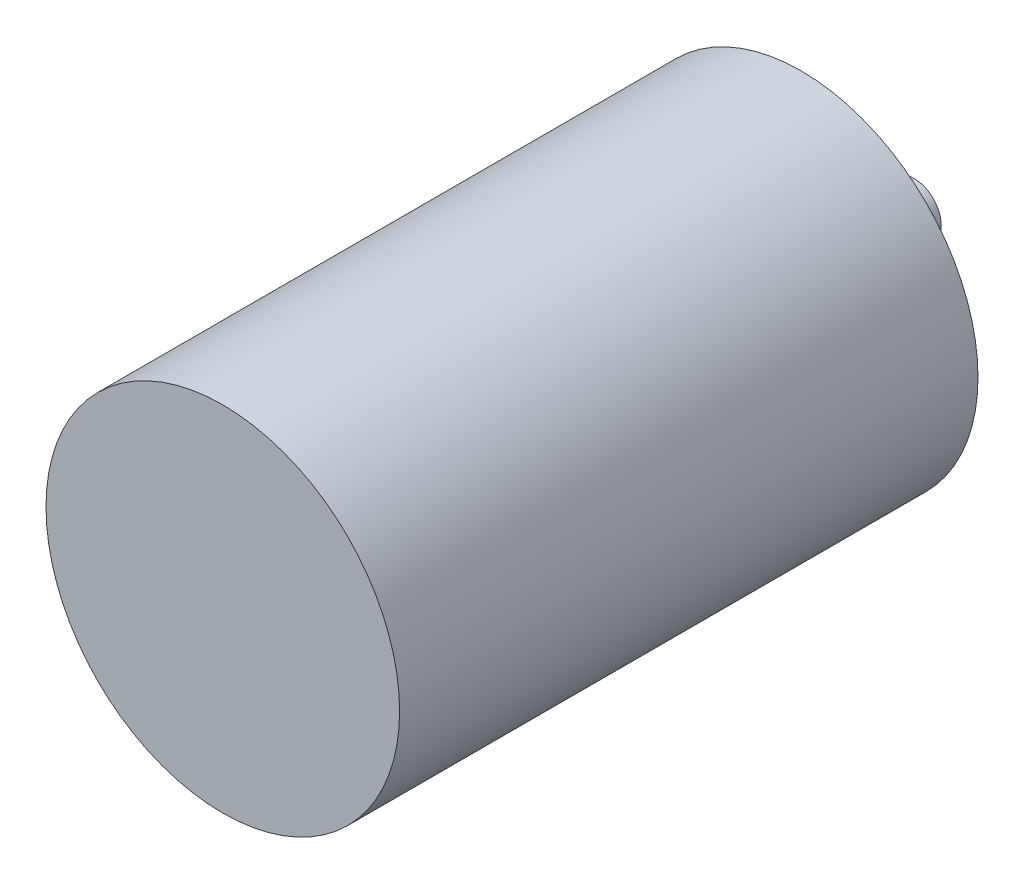
ISO-10303-21;
HEADER;
FILE_DESCRIPTION(('STEP AP214'),'2;1');
FILE_NAME('part.step','',(''),(''),'','','');
FILE_SCHEMA(('AUTOMOTIVE_DESIGN { 1 0 10303 214 1 1 1 1 }'));
ENDSEC;
DATA;
#1=APPLICATION_CONTEXT('core data for automotive mechanical design processes');
#2=APPLICATION_PROTOCOL_DEFINITION('international standard','automotive_design',2000,#1);
#3=PRODUCT_CONTEXT('',#1,'mechanical');
#4=PRODUCT('Part','Part','',(#3));
#5=PRODUCT_RELATED_PRODUCT_CATEGORY('part','',(#4));
#6=PRODUCT_DEFINITION_FORMATION('','',#4);
#7=PRODUCT_DEFINITION_CONTEXT('part definition',#1,'design');
#8=PRODUCT_DEFINITION('design','',#6,#7);
#9=PRODUCT_DEFINITION_SHAPE('','',#8);
#10=(LENGTH_UNIT() NAMED_UNIT(*) SI_UNIT(.MILLI.,.METRE.));
#11=(NAMED_UNIT(*) PLANE_ANGLE_UNIT() SI_UNIT($,.RADIAN.));
#12=(NAMED_UNIT(*) SI_UNIT($,.STERADIAN.) SOLID_ANGLE_UNIT());
#13=UNCERTAINTY_MEASURE_WITH_UNIT(LENGTH_MEASURE(1.E-05),#10,'distance_accuracy_value','');
#14=(GEOMETRIC_REPRESENTATION_CONTEXT(3) GLOBAL_UNCERTAINTY_ASSIGNED_CONTEXT((#13)) GLOBAL_UNIT_ASSIGNED_CONTEXT((#10,
#11,#12)) REPRESENTATION_CONTEXT('',''));
#15=CARTESIAN_POINT('',(0.,0.,0.));
#16=DIRECTION('',(0.,0.,1.));
#17=DIRECTION('',(1.,0.,0.));
#18=AXIS2_PLACEMENT_3D('',#15,#16,#17);
#19=CARTESIAN_POINT('',(0.,0.,128.));
#20=DIRECTION('',(0.,0.,-1.));
#21=DIRECTION('',(-1.,0.,0.));
#22=AXIS2_PLACEMENT_3D('',#19,#20,#21);
#23=CYLINDRICAL_SURFACE('',#22,39.125);
#24=CARTESIAN_POINT('',(0.,0.,128.));
#25=DIRECTION('',(0.,0.,1.));
#26=DIRECTION('',(1.,0.,0.));
#27=AXIS2_PLACEMENT_3D('',#24,#25,#26);
#28=CIRCLE('',#27,39.125);
#29=CARTESIAN_POINT('',(39.125,0.,128.));
#30=VERTEX_POINT('',#29);
#31=EDGE_CURVE('E11',#30,#30,#28,.T.);
#32=ORIENTED_EDGE('',*,*,#31,.F.);
#33=EDGE_LOOP('',(#32));
#34=FACE_BOUND('',#33,.T.);
#35=CARTESIAN_POINT('',(0.,0.,0.));
#36=DIRECTION('',(0.,0.,1.));
#37=DIRECTION('',(1.,0.,0.));
#38=AXIS2_PLACEMENT_3D('',#35,#36,#37);
#39=CIRCLE('',#38,39.125);
#40=CARTESIAN_POINT('',(39.125,0.,0.));
#41=VERTEX_POINT('',#40);
#42=EDGE_CURVE('E46',#41,#41,#39,.T.);
#43=ORIENTED_EDGE('',*,*,#42,.T.);
#44=EDGE_LOOP('',(#43));
#45=FACE_BOUND('',#44,.T.);
#46=ADVANCED_FACE('F43',(#34,#45),#23,.T.);
#47=CARTESIAN_POINT('',(0.,0.,128.));
#48=DIRECTION('',(0.,0.,1.));
#49=DIRECTION('',(1.,0.,0.));
#50=AXIS2_PLACEMENT_3D('',#47,#48,#49);
#51=PLANE('',#50);
#52=ORIENTED_EDGE('',*,*,#31,.T.);
#53=EDGE_LOOP('',(#52));
#54=FACE_BOUND('',#53,.T.);
#55=ADVANCED_FACE('F128',(#54),#51,.T.);
#56=CARTESIAN_POINT('',(0.,0.,0.));
#57=DIRECTION('',(0.,0.,1.));
#58=DIRECTION('',(1.,0.,0.));
#59=AXIS2_PLACEMENT_3D('',#56,#57,#58);
#60=PLANE('',#59);
#61=CARTESIAN_POINT('',(0.,0.,0.));
#62=DIRECTION('',(0.,0.,1.));
#63=DIRECTION('',(1.,0.,0.));
#64=AXIS2_PLACEMENT_3D('',#61,#62,#63);
#65=CIRCLE('',#64,6.);
#66=CARTESIAN_POINT('',(6.,0.,0.));
#67=VERTEX_POINT('',#66);
#68=EDGE_CURVE('E302',#67,#67,#65,.T.);
#69=ORIENTED_EDGE('',*,*,#68,.T.);
#70=EDGE_LOOP('',(#69));
#71=FACE_BOUND('',#70,.T.);
#72=CARTESIAN_POINT('',(0.,26.,0.));
#73=DIRECTION('',(0.,0.,-1.));
#74=DIRECTION('',(-1.,0.,0.));
#75=AXIS2_PLACEMENT_3D('',#72,#73,#74);
#76=CIRCLE('',#75,2.525);
#77=CARTESIAN_POINT('',(-2.525,26.,0.));
#78=VERTEX_POINT('',#77);
#79=EDGE_CURVE('E84',#78,#78,#76,.T.);
#80=ORIENTED_EDGE('',*,*,#79,.F.);
#81=EDGE_LOOP('',(#80));
#82=FACE_BOUND('',#81,.T.);
#83=CARTESIAN_POINT('',(26.,0.,0.));
#84=DIRECTION('',(0.,0.,-1.));
#85=DIRECTION('',(-1.,0.,0.));
#86=AXIS2_PLACEMENT_3D('',#83,#84,#85);
#87=CIRCLE('',#86,2.525);
#88=CARTESIAN_POINT('',(23.475,0.,0.));
#89=VERTEX_POINT('',#88);
#90=EDGE_CURVE('E75',#89,#89,#87,.T.);
#91=ORIENTED_EDGE('',*,*,#90,.F.);
#92=EDGE_LOOP('',(#91));
#93=FACE_BOUND('',#92,.T.);
#94=CARTESIAN_POINT('',(0.,-26.,0.));
#95=DIRECTION('',(0.,0.,-1.));
#96=DIRECTION('',(-1.,0.,0.));
#97=AXIS2_PLACEMENT_3D('',#94,#95,#96);
#98=CIRCLE('',#97,2.525);
#99=CARTESIAN_POINT('',(-2.525,-26.,0.));
#100=VERTEX_POINT('',#99);
#101=EDGE_CURVE('E95',#100,#100,#98,.T.);
#102=ORIENTED_EDGE('',*,*,#101,.F.);
#103=EDGE_LOOP('',(#102));
#104=FACE_BOUND('',#103,.T.);
#105=CARTESIAN_POINT('',(-26.,0.,0.));
#106=DIRECTION('',(0.,0.,-1.));
#107=DIRECTION('',(-1.,0.,0.));
#108=AXIS2_PLACEMENT_3D('',#105,#106,#107);
#109=CIRCLE('',#108,2.525);
#110=CARTESIAN_POINT('',(-28.525,0.,0.));
#111=VERTEX_POINT('',#110);
#112=EDGE_CURVE('E107',#111,#111,#109,.T.);
#113=ORIENTED_EDGE('',*,*,#112,.F.);
#114=EDGE_LOOP('',(#113));
#115=FACE_BOUND('',#114,.T.);
#116=ORIENTED_EDGE('',*,*,#42,.F.);
#117=EDGE_LOOP('',(#116));
#118=FACE_BOUND('',#117,.T.);
#119=ADVANCED_FACE('F125',(#71,#82,#93,#104,#115,#118),#60,.F.);
#120=CARTESIAN_POINT('',(-26.,0.,10.));
#121=DIRECTION('',(0.,0.,-1.));
#122=DIRECTION('',(-1.,0.,0.));
#123=AXIS2_PLACEMENT_3D('',#120,#121,#122);
#124=CONICAL_SURFACE('',#123,2.1,1.02974425867665);
#125=CARTESIAN_POINT('',(-26.,0.,11.2618072999579));
#126=VERTEX_POINT('',#125);
#127=VERTEX_LOOP('',#126);
#128=FACE_BOUND('',#127,.T.);
#129=CARTESIAN_POINT('',(-26.,0.,10.));
#130=DIRECTION('',(0.,0.,-1.));
#131=DIRECTION('',(-1.,0.,0.));
#132=AXIS2_PLACEMENT_3D('',#129,#130,#131);
#133=CIRCLE('',#132,2.1);
#134=CARTESIAN_POINT('',(-28.1,0.,10.));
#135=VERTEX_POINT('',#134);
#136=EDGE_CURVE('E115',#135,#135,#133,.T.);
#137=ORIENTED_EDGE('',*,*,#136,.T.);
#138=EDGE_LOOP('',(#137));
#139=FACE_BOUND('',#138,.T.);
#140=ADVANCED_FACE('F127',(#128,#139),#124,.F.);
#141=CARTESIAN_POINT('',(-26.,0.,0.));
#142=DIRECTION('',(0.,0.,-1.));
#143=DIRECTION('',(-1.,0.,0.));
#144=AXIS2_PLACEMENT_3D('',#141,#142,#143);
#145=CYLINDRICAL_SURFACE('',#144,2.1);
#146=ORIENTED_EDGE('',*,*,#136,.F.);
#147=EDGE_LOOP('',(#146));
#148=FACE_BOUND('',#147,.T.);
#149=CARTESIAN_POINT('',(-26.,0.,0.425000000000005));
#150=DIRECTION('',(0.,0.,-1.));
#151=DIRECTION('',(-1.,0.,0.));
#152=AXIS2_PLACEMENT_3D('',#149,#150,#151);
#153=CIRCLE('',#152,2.1);
#154=CARTESIAN_POINT('',(-28.1,0.,0.425000000000005));
#155=VERTEX_POINT('',#154);
#156=EDGE_CURVE('E111',#155,#155,#153,.T.);
#157=ORIENTED_EDGE('',*,*,#156,.T.);
#158=EDGE_LOOP('',(#157));
#159=FACE_BOUND('',#158,.T.);
#160=ADVANCED_FACE('F134',(#148,#159),#145,.F.);
#161=CARTESIAN_POINT('',(-26.,0.,0.));
#162=DIRECTION('',(0.,0.,-1.));
#163=DIRECTION('',(-1.,0.,0.));
#164=AXIS2_PLACEMENT_3D('',#161,#162,#163);
#165=CONICAL_SURFACE('',#164,2.525,0.785398163397443);
#166=ORIENTED_EDGE('',*,*,#156,.F.);
#167=EDGE_LOOP('',(#166));
#168=FACE_BOUND('',#167,.T.);
#169=ORIENTED_EDGE('',*,*,#112,.T.);
#170=EDGE_LOOP('',(#169));
#171=FACE_BOUND('',#170,.T.);
#172=ADVANCED_FACE('F166',(#168,#171),#165,.F.);
#173=CARTESIAN_POINT('',(0.,-26.,10.));
#174=DIRECTION('',(0.,0.,-1.));
#175=DIRECTION('',(-1.,0.,0.));
#176=AXIS2_PLACEMENT_3D('',#173,#174,#175);
#177=CONICAL_SURFACE('',#176,2.1,1.02974425867665);
#178=CARTESIAN_POINT('',(0.,-26.,11.2618072999579));
#179=VERTEX_POINT('',#178);
#180=VERTEX_LOOP('',#179);
#181=FACE_BOUND('',#180,.T.);
#182=CARTESIAN_POINT('',(0.,-26.,10.));
#183=DIRECTION('',(0.,0.,-1.));
#184=DIRECTION('',(-1.,0.,0.));
#185=AXIS2_PLACEMENT_3D('',#182,#183,#184);
#186=CIRCLE('',#185,2.1);
#187=CARTESIAN_POINT('',(-2.1,-26.,10.));
#188=VERTEX_POINT('',#187);
#189=EDGE_CURVE('E103',#188,#188,#186,.T.);
#190=ORIENTED_EDGE('',*,*,#189,.T.);
#191=EDGE_LOOP('',(#190));
#192=FACE_BOUND('',#191,.T.);
#193=ADVANCED_FACE('F179',(#181,#192),#177,.F.);
#194=CARTESIAN_POINT('',(0.,-26.,0.));
#195=DIRECTION('',(0.,0.,-1.));
#196=DIRECTION('',(-1.,0.,0.));
#197=AXIS2_PLACEMENT_3D('',#194,#195,#196);
#198=CYLINDRICAL_SURFACE('',#197,2.1);
#199=ORIENTED_EDGE('',*,*,#189,.F.);
#200=EDGE_LOOP('',(#199));
#201=FACE_BOUND('',#200,.T.);
#202=CARTESIAN_POINT('',(0.,-26.,0.425000000000005));
#203=DIRECTION('',(0.,0.,-1.));
#204=DIRECTION('',(-1.,0.,0.));
#205=AXIS2_PLACEMENT_3D('',#202,#203,#204);
#206=CIRCLE('',#205,2.1);
#207=CARTESIAN_POINT('',(-2.1,-26.,0.425000000000005));
#208=VERTEX_POINT('',#207);
#209=EDGE_CURVE('E99',#208,#208,#206,.T.);
#210=ORIENTED_EDGE('',*,*,#209,.T.);
#211=EDGE_LOOP('',(#210));
#212=FACE_BOUND('',#211,.T.);
#213=ADVANCED_FACE('F190',(#201,#212),#198,.F.);
#214=CARTESIAN_POINT('',(0.,-26.,0.));
#215=DIRECTION('',(0.,0.,-1.));
#216=DIRECTION('',(-1.,0.,0.));
#217=AXIS2_PLACEMENT_3D('',#214,#215,#216);
#218=CONICAL_SURFACE('',#217,2.525,0.785398163397442);
#219=ORIENTED_EDGE('',*,*,#209,.F.);
#220=EDGE_LOOP('',(#219));
#221=FACE_BOUND('',#220,.T.);
#222=ORIENTED_EDGE('',*,*,#101,.T.);
#223=EDGE_LOOP('',(#222));
#224=FACE_BOUND('',#223,.T.);
#225=ADVANCED_FACE('F199',(#221,#224),#218,.F.);
#226=CARTESIAN_POINT('',(26.,0.,10.));
#227=DIRECTION('',(0.,0.,-1.));
#228=DIRECTION('',(-1.,0.,0.));
#229=AXIS2_PLACEMENT_3D('',#226,#227,#228);
#230=CONICAL_SURFACE('',#229,2.1,1.02974425867665);
#231=CARTESIAN_POINT('',(26.,0.,11.2618072999579));
#232=VERTEX_POINT('',#231);
#233=VERTEX_LOOP('',#232);
#234=FACE_BOUND('',#233,.T.);
#235=CARTESIAN_POINT('',(26.,0.,10.));
#236=DIRECTION('',(0.,0.,-1.));
#237=DIRECTION('',(-1.,0.,0.));
#238=AXIS2_PLACEMENT_3D('',#235,#236,#237);
#239=CIRCLE('',#238,2.1);
#240=CARTESIAN_POINT('',(23.9,0.,10.));
#241=VERTEX_POINT('',#240);
#242=EDGE_CURVE('E91',#241,#241,#239,.T.);
#243=ORIENTED_EDGE('',*,*,#242,.T.);
#244=EDGE_LOOP('',(#243));
#245=FACE_BOUND('',#244,.T.);
#246=ADVANCED_FACE('F211',(#234,#245),#230,.F.);
#247=CARTESIAN_POINT('',(26.,0.,0.));
#248=DIRECTION('',(0.,0.,-1.));
#249=DIRECTION('',(-1.,0.,0.));
#250=AXIS2_PLACEMENT_3D('',#247,#248,#249);
#251=CYLINDRICAL_SURFACE('',#250,2.1);
#252=ORIENTED_EDGE('',*,*,#242,.F.);
#253=EDGE_LOOP('',(#252));
#254=FACE_BOUND('',#253,.T.);
#255=CARTESIAN_POINT('',(26.,0.,0.425000000000005));
#256=DIRECTION('',(0.,0.,-1.));
#257=DIRECTION('',(-1.,0.,0.));
#258=AXIS2_PLACEMENT_3D('',#255,#256,#257);
#259=CIRCLE('',#258,2.1);
#260=CARTESIAN_POINT('',(23.9,0.,0.425000000000005));
#261=VERTEX_POINT('',#260);
#262=EDGE_CURVE('E81',#261,#261,#259,.T.);
#263=ORIENTED_EDGE('',*,*,#262,.T.);
#264=EDGE_LOOP('',(#263));
#265=FACE_BOUND('',#264,.T.);
#266=ADVANCED_FACE('F222',(#254,#265),#251,.F.);
#267=CARTESIAN_POINT('',(26.,0.,0.));
#268=DIRECTION('',(0.,0.,-1.));
#269=DIRECTION('',(-1.,0.,0.));
#270=AXIS2_PLACEMENT_3D('',#267,#268,#269);
#271=CONICAL_SURFACE('',#270,2.525,0.785398163397443);
#272=ORIENTED_EDGE('',*,*,#262,.F.);
#273=EDGE_LOOP('',(#272));
#274=FACE_BOUND('',#273,.T.);
#275=ORIENTED_EDGE('',*,*,#90,.T.);
#276=EDGE_LOOP('',(#275));
#277=FACE_BOUND('',#276,.T.);
#278=ADVANCED_FACE('F68',(#274,#277),#271,.F.);
#279=CARTESIAN_POINT('',(0.,26.,10.));
#280=DIRECTION('',(0.,0.,-1.));
#281=DIRECTION('',(-1.,0.,0.));
#282=AXIS2_PLACEMENT_3D('',#279,#280,#281);
#283=CONICAL_SURFACE('',#282,2.1,1.02974425867665);
#284=CARTESIAN_POINT('',(0.,26.,11.2618072999579));
#285=VERTEX_POINT('',#284);
#286=VERTEX_LOOP('',#285);
#287=FACE_BOUND('',#286,.T.);
#288=CARTESIAN_POINT('',(0.,26.,10.));
#289=DIRECTION('',(0.,0.,-1.));
#290=DIRECTION('',(-1.,0.,0.));
#291=AXIS2_PLACEMENT_3D('',#288,#289,#290);
#292=CIRCLE('',#291,2.1);
#293=CARTESIAN_POINT('',(-2.1,26.,10.));
#294=VERTEX_POINT('',#293);
#295=EDGE_CURVE('E72',#294,#294,#292,.T.);
#296=ORIENTED_EDGE('',*,*,#295,.T.);
#297=EDGE_LOOP('',(#296));
#298=FACE_BOUND('',#297,.T.);
#299=ADVANCED_FACE('F64',(#287,#298),#283,.F.);
#300=CARTESIAN_POINT('',(0.,26.,0.));
#301=DIRECTION('',(0.,0.,-1.));
#302=DIRECTION('',(-1.,0.,0.));
#303=AXIS2_PLACEMENT_3D('',#300,#301,#302);
#304=CYLINDRICAL_SURFACE('',#303,2.1);
#305=ORIENTED_EDGE('',*,*,#295,.F.);
#306=EDGE_LOOP('',(#305));
#307=FACE_BOUND('',#306,.T.);
#308=CARTESIAN_POINT('',(0.,26.,0.425000000000005));
#309=DIRECTION('',(0.,0.,-1.));
#310=DIRECTION('',(-1.,0.,0.));
#311=AXIS2_PLACEMENT_3D('',#308,#309,#310);
#312=CIRCLE('',#311,2.1);
#313=CARTESIAN_POINT('',(-2.1,26.,0.425000000000005));
#314=VERTEX_POINT('',#313);
#315=EDGE_CURVE('E76',#314,#314,#312,.T.);
#316=ORIENTED_EDGE('',*,*,#315,.T.);
#317=EDGE_LOOP('',(#316));
#318=FACE_BOUND('',#317,.T.);
#319=ADVANCED_FACE('F67',(#307,#318),#304,.F.);
#320=CARTESIAN_POINT('',(0.,26.,0.));
#321=DIRECTION('',(0.,0.,-1.));
#322=DIRECTION('',(-1.,0.,0.));
#323=AXIS2_PLACEMENT_3D('',#320,#321,#322);
#324=CONICAL_SURFACE('',#323,2.525,0.785398163397442);
#325=ORIENTED_EDGE('',*,*,#315,.F.);
#326=EDGE_LOOP('',(#325));
#327=FACE_BOUND('',#326,.T.);
#328=ORIENTED_EDGE('',*,*,#79,.T.);
#329=EDGE_LOOP('',(#328));
#330=FACE_BOUND('',#329,.T.);
#331=ADVANCED_FACE('F259',(#327,#330),#324,.F.);
#332=CARTESIAN_POINT('',(0.,0.,-25.));
#333=DIRECTION('',(0.,0.,1.));
#334=DIRECTION('',(1.,0.,0.));
#335=AXIS2_PLACEMENT_3D('',#332,#333,#334);
#336=CYLINDRICAL_SURFACE('',#335,6.);
#337=CARTESIAN_POINT('',(0.,0.,-25.));
#338=DIRECTION('',(0.,0.,1.));
#339=DIRECTION('',(1.,0.,0.));
#340=AXIS2_PLACEMENT_3D('',#337,#338,#339);
#341=CIRCLE('',#340,6.);
#342=CARTESIAN_POINT('',(6.,0.,-25.));
#343=VERTEX_POINT('',#342);
#344=EDGE_CURVE('E300',#343,#343,#341,.T.);
#345=ORIENTED_EDGE('',*,*,#344,.T.);
#346=EDGE_LOOP('',(#345));
#347=FACE_BOUND('',#346,.T.);
#348=ORIENTED_EDGE('',*,*,#68,.F.);
#349=EDGE_LOOP('',(#348));
#350=FACE_BOUND('',#349,.T.);
#351=ADVANCED_FACE('F268',(#347,#350),#336,.T.);
#352=CARTESIAN_POINT('',(0.,0.,-25.));
#353=DIRECTION('',(0.,0.,1.));
#354=DIRECTION('',(1.,0.,0.));
#355=AXIS2_PLACEMENT_3D('',#352,#353,#354);
#356=PLANE('',#355);
#357=ORIENTED_EDGE('',*,*,#344,.F.);
#358=EDGE_LOOP('',(#357));
#359=FACE_BOUND('',#358,.T.);
#360=ADVANCED_FACE('F284',(#359),#356,.F.);
#361=CLOSED_SHELL('',(#46,#55,#119,#140,#160,#172,#193,#213,#225,#246,#266,#278,#299,#319,#331,
#351,#360));
#362=MANIFOLD_SOLID_BREP('B2',#361);
#363=ADVANCED_BREP_SHAPE_REPRESENTATION('',(#18,#362),#14);
#364=SHAPE_DEFINITION_REPRESENTATION(#9,#363);
ENDSEC;
END-ISO-10303-21;
